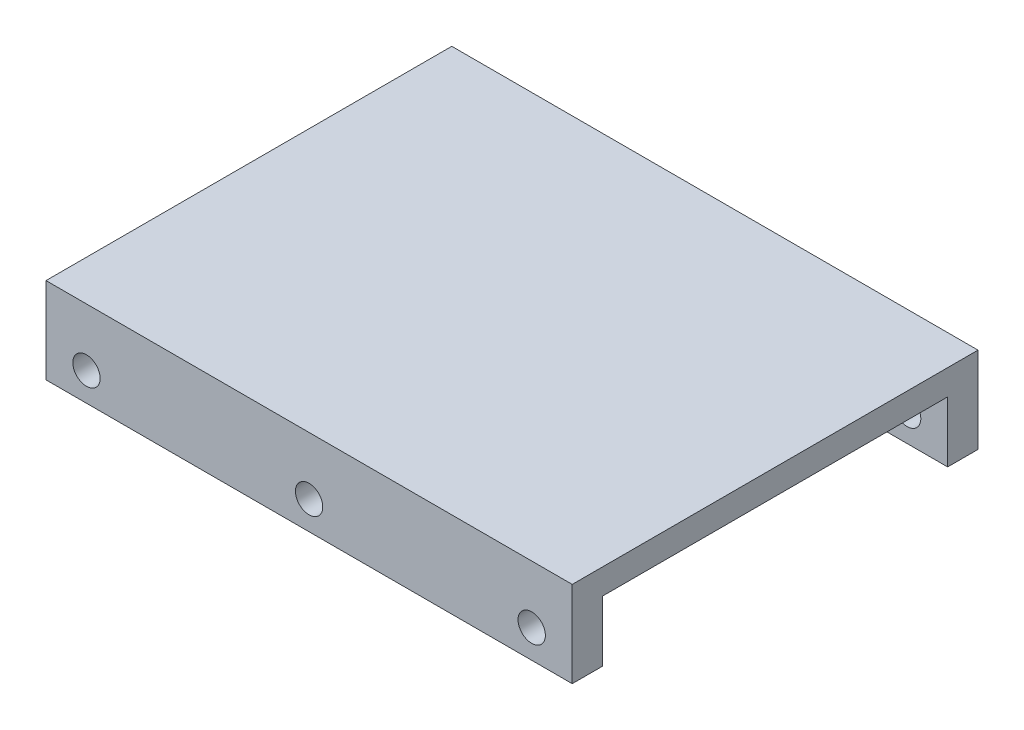
ISO-10303-21;
HEADER;
FILE_DESCRIPTION(('STEP AP214'),'2;1');
FILE_NAME('part.step','',(''),(''),'','','');
FILE_SCHEMA(('AUTOMOTIVE_DESIGN { 1 0 10303 214 1 1 1 1 }'));
ENDSEC;
DATA;
#1=APPLICATION_CONTEXT('core data for automotive mechanical design processes');
#2=APPLICATION_PROTOCOL_DEFINITION('international standard','automotive_design',2000,#1);
#3=PRODUCT_CONTEXT('',#1,'mechanical');
#4=PRODUCT('Part','Part','',(#3));
#5=PRODUCT_RELATED_PRODUCT_CATEGORY('part','',(#4));
#6=PRODUCT_DEFINITION_FORMATION('','',#4);
#7=PRODUCT_DEFINITION_CONTEXT('part definition',#1,'design');
#8=PRODUCT_DEFINITION('design','',#6,#7);
#9=PRODUCT_DEFINITION_SHAPE('','',#8);
#10=(LENGTH_UNIT() NAMED_UNIT(*) SI_UNIT(.MILLI.,.METRE.));
#11=(NAMED_UNIT(*) PLANE_ANGLE_UNIT() SI_UNIT($,.RADIAN.));
#12=(NAMED_UNIT(*) SI_UNIT($,.STERADIAN.) SOLID_ANGLE_UNIT());
#13=UNCERTAINTY_MEASURE_WITH_UNIT(LENGTH_MEASURE(1.E-05),#10,'distance_accuracy_value','');
#14=(GEOMETRIC_REPRESENTATION_CONTEXT(3) GLOBAL_UNCERTAINTY_ASSIGNED_CONTEXT((#13)) GLOBAL_UNIT_ASSIGNED_CONTEXT((#10,
#11,#12)) REPRESENTATION_CONTEXT('',''));
#15=CARTESIAN_POINT('',(0.,0.,0.));
#16=DIRECTION('',(0.,0.,1.));
#17=DIRECTION('',(1.,0.,0.));
#18=AXIS2_PLACEMENT_3D('',#15,#16,#17);
#19=CARTESIAN_POINT('',(76.,0.,40.1));
#20=DIRECTION('',(0.,1.,0.));
#21=DIRECTION('',(-1.,0.,0.));
#22=AXIS2_PLACEMENT_3D('',#19,#20,#21);
#23=PLANE('',#22);
#24=DIRECTION('',(1.,0.,0.));
#25=VECTOR('',#24,1.);
#26=CARTESIAN_POINT('',(76.,0.,40.1));
#27=LINE('',#26,#25);
#28=CARTESIAN_POINT('',(23.996,0.,40.1));
#29=VERTEX_POINT('',#28);
#30=CARTESIAN_POINT('',(76.,0.,40.1));
#31=VERTEX_POINT('',#30);
#32=EDGE_CURVE('E132',#29,#31,#27,.T.);
#33=ORIENTED_EDGE('',*,*,#32,.F.);
#34=DIRECTION('',(0.,0.,1.));
#35=VECTOR('',#34,1.);
#36=CARTESIAN_POINT('',(23.996,0.,0.));
#37=LINE('',#36,#35);
#38=CARTESIAN_POINT('',(23.996,0.,37.1));
#39=VERTEX_POINT('',#38);
#40=EDGE_CURVE('E105',#39,#29,#37,.T.);
#41=ORIENTED_EDGE('',*,*,#40,.F.);
#42=DIRECTION('',(-1.,0.,0.));
#43=VECTOR('',#42,1.);
#44=CARTESIAN_POINT('',(19.,0.,37.1));
#45=LINE('',#44,#43);
#46=CARTESIAN_POINT('',(76.,0.,37.1));
#47=VERTEX_POINT('',#46);
#48=EDGE_CURVE('E198',#47,#39,#45,.T.);
#49=ORIENTED_EDGE('',*,*,#48,.F.);
#50=DIRECTION('',(0.,0.,-1.));
#51=VECTOR('',#50,1.);
#52=CARTESIAN_POINT('',(76.,0.,40.1));
#53=LINE('',#52,#51);
#54=EDGE_CURVE('E137',#31,#47,#53,.T.);
#55=ORIENTED_EDGE('',*,*,#54,.F.);
#56=EDGE_LOOP('',(#33,#41,#49,#55));
#57=FACE_BOUND('',#56,.T.);
#58=ADVANCED_FACE('F34',(#57),#23,.F.);
#59=CARTESIAN_POINT('',(27.996,2.8,-10.7));
#60=DIRECTION('',(0.,0.,1.));
#61=DIRECTION('',(1.,0.,0.));
#62=AXIS2_PLACEMENT_3D('',#59,#60,#61);
#63=CYLINDRICAL_SURFACE('',#62,1.35);
#64=CARTESIAN_POINT('',(27.996,2.8,37.1));
#65=DIRECTION('',(0.,0.,1.));
#66=DIRECTION('',(1.,0.,0.));
#67=AXIS2_PLACEMENT_3D('',#64,#65,#66);
#68=CIRCLE('',#67,1.35);
#69=CARTESIAN_POINT('',(29.346,2.8,37.1));
#70=VERTEX_POINT('',#69);
#71=EDGE_CURVE('E175',#70,#70,#68,.F.);
#72=ORIENTED_EDGE('',*,*,#71,.T.);
#73=EDGE_LOOP('',(#72));
#74=FACE_BOUND('',#73,.T.);
#75=CARTESIAN_POINT('',(27.996,2.8,40.1));
#76=DIRECTION('',(0.,0.,1.));
#77=DIRECTION('',(1.,0.,0.));
#78=AXIS2_PLACEMENT_3D('',#75,#76,#77);
#79=CIRCLE('',#78,1.35);
#80=CARTESIAN_POINT('',(29.346,2.8,40.1));
#81=VERTEX_POINT('',#80);
#82=EDGE_CURVE('E125',#81,#81,#79,.T.);
#83=ORIENTED_EDGE('',*,*,#82,.T.);
#84=EDGE_LOOP('',(#83));
#85=FACE_BOUND('',#84,.T.);
#86=ADVANCED_FACE('F231',(#74,#85),#63,.F.);
#87=CARTESIAN_POINT('',(49.996,2.8,-10.7));
#88=DIRECTION('',(0.,0.,1.));
#89=DIRECTION('',(1.,0.,0.));
#90=AXIS2_PLACEMENT_3D('',#87,#88,#89);
#91=CYLINDRICAL_SURFACE('',#90,1.35);
#92=CARTESIAN_POINT('',(49.996,2.8,37.1));
#93=DIRECTION('',(0.,0.,1.));
#94=DIRECTION('',(1.,0.,0.));
#95=AXIS2_PLACEMENT_3D('',#92,#93,#94);
#96=CIRCLE('',#95,1.35);
#97=CARTESIAN_POINT('',(51.346,2.8,37.1));
#98=VERTEX_POINT('',#97);
#99=EDGE_CURVE('E155',#98,#98,#96,.F.);
#100=ORIENTED_EDGE('',*,*,#99,.T.);
#101=EDGE_LOOP('',(#100));
#102=FACE_BOUND('',#101,.T.);
#103=CARTESIAN_POINT('',(49.996,2.8,40.1));
#104=DIRECTION('',(0.,0.,1.));
#105=DIRECTION('',(1.,0.,0.));
#106=AXIS2_PLACEMENT_3D('',#103,#104,#105);
#107=CIRCLE('',#106,1.35);
#108=CARTESIAN_POINT('',(51.346,2.8,40.1));
#109=VERTEX_POINT('',#108);
#110=EDGE_CURVE('E143',#109,#109,#107,.T.);
#111=ORIENTED_EDGE('',*,*,#110,.T.);
#112=EDGE_LOOP('',(#111));
#113=FACE_BOUND('',#112,.T.);
#114=ADVANCED_FACE('F213',(#102,#113),#91,.F.);
#115=CARTESIAN_POINT('',(71.996,2.8,-10.7));
#116=DIRECTION('',(0.,0.,1.));
#117=DIRECTION('',(1.,0.,0.));
#118=AXIS2_PLACEMENT_3D('',#115,#116,#117);
#119=CYLINDRICAL_SURFACE('',#118,1.35000000000001);
#120=CARTESIAN_POINT('',(71.996,2.8,37.1));
#121=DIRECTION('',(0.,0.,1.));
#122=DIRECTION('',(1.,0.,0.));
#123=AXIS2_PLACEMENT_3D('',#120,#121,#122);
#124=CIRCLE('',#123,1.35000000000001);
#125=CARTESIAN_POINT('',(73.346,2.8,37.1));
#126=VERTEX_POINT('',#125);
#127=EDGE_CURVE('E153',#126,#126,#124,.F.);
#128=ORIENTED_EDGE('',*,*,#127,.T.);
#129=EDGE_LOOP('',(#128));
#130=FACE_BOUND('',#129,.T.);
#131=CARTESIAN_POINT('',(71.996,2.8,40.1));
#132=DIRECTION('',(0.,0.,1.));
#133=DIRECTION('',(1.,0.,0.));
#134=AXIS2_PLACEMENT_3D('',#131,#132,#133);
#135=CIRCLE('',#134,1.35000000000001);
#136=CARTESIAN_POINT('',(73.346,2.8,40.1));
#137=VERTEX_POINT('',#136);
#138=EDGE_CURVE('E147',#137,#137,#135,.T.);
#139=ORIENTED_EDGE('',*,*,#138,.T.);
#140=EDGE_LOOP('',(#139));
#141=FACE_BOUND('',#140,.T.);
#142=ADVANCED_FACE('F240',(#130,#141),#119,.F.);
#143=DIRECTION('',(1.,0.,0.));
#144=VECTOR('',#143,1.);
#145=CARTESIAN_POINT('',(19.,0.,3.));
#146=LINE('',#145,#144);
#147=CARTESIAN_POINT('',(23.996,0.,3.));
#148=VERTEX_POINT('',#147);
#149=CARTESIAN_POINT('',(76.,0.,3.));
#150=VERTEX_POINT('',#149);
#151=EDGE_CURVE('E113',#148,#150,#146,.T.);
#152=ORIENTED_EDGE('',*,*,#151,.F.);
#153=CARTESIAN_POINT('',(23.996,0.,0.));
#154=VERTEX_POINT('',#153);
#155=EDGE_CURVE('E49',#154,#148,#37,.T.);
#156=ORIENTED_EDGE('',*,*,#155,.F.);
#157=DIRECTION('',(1.,0.,0.));
#158=VECTOR('',#157,1.);
#159=CARTESIAN_POINT('',(76.,0.,0.));
#160=LINE('',#159,#158);
#161=CARTESIAN_POINT('',(76.,0.,0.));
#162=VERTEX_POINT('',#161);
#163=EDGE_CURVE('E111',#154,#162,#160,.T.);
#164=ORIENTED_EDGE('',*,*,#163,.T.);
#165=EDGE_CURVE('E136',#150,#162,#53,.T.);
#166=ORIENTED_EDGE('',*,*,#165,.F.);
#167=EDGE_LOOP('',(#152,#156,#164,#166));
#168=FACE_BOUND('',#167,.T.);
#169=ADVANCED_FACE('F36',(#168),#23,.F.);
#170=CARTESIAN_POINT('',(76.,8.5,40.1));
#171=DIRECTION('',(-1.,0.,0.));
#172=DIRECTION('',(0.,0.,1.));
#173=AXIS2_PLACEMENT_3D('',#170,#171,#172);
#174=PLANE('',#173);
#175=ORIENTED_EDGE('',*,*,#54,.T.);
#176=DIRECTION('',(0.,1.,0.));
#177=VECTOR('',#176,1.);
#178=CARTESIAN_POINT('',(76.,8.5,37.1));
#179=LINE('',#178,#177);
#180=CARTESIAN_POINT('',(76.,6.,37.1));
#181=VERTEX_POINT('',#180);
#182=EDGE_CURVE('E168',#47,#181,#179,.T.);
#183=ORIENTED_EDGE('',*,*,#182,.T.);
#184=DIRECTION('',(0.,0.,1.));
#185=VECTOR('',#184,1.);
#186=CARTESIAN_POINT('',(76.,6.,40.1));
#187=LINE('',#186,#185);
#188=CARTESIAN_POINT('',(76.,6.,3.));
#189=VERTEX_POINT('',#188);
#190=EDGE_CURVE('E42',#189,#181,#187,.T.);
#191=ORIENTED_EDGE('',*,*,#190,.F.);
#192=DIRECTION('',(0.,-1.,0.));
#193=VECTOR('',#192,1.);
#194=CARTESIAN_POINT('',(76.,8.5,3.));
#195=LINE('',#194,#193);
#196=EDGE_CURVE('E156',#189,#150,#195,.T.);
#197=ORIENTED_EDGE('',*,*,#196,.T.);
#198=ORIENTED_EDGE('',*,*,#165,.T.);
#199=DIRECTION('',(0.,1.,0.));
#200=VECTOR('',#199,1.);
#201=CARTESIAN_POINT('',(76.,8.5,0.));
#202=LINE('',#201,#200);
#203=CARTESIAN_POINT('',(76.,8.5,0.));
#204=VERTEX_POINT('',#203);
#205=EDGE_CURVE('E119',#162,#204,#202,.T.);
#206=ORIENTED_EDGE('',*,*,#205,.T.);
#207=DIRECTION('',(0.,0.,-1.));
#208=VECTOR('',#207,1.);
#209=CARTESIAN_POINT('',(76.,8.5,40.1));
#210=LINE('',#209,#208);
#211=CARTESIAN_POINT('',(76.,8.5,40.1));
#212=VERTEX_POINT('',#211);
#213=EDGE_CURVE('E133',#212,#204,#210,.T.);
#214=ORIENTED_EDGE('',*,*,#213,.F.);
#215=DIRECTION('',(0.,1.,0.));
#216=VECTOR('',#215,1.);
#217=CARTESIAN_POINT('',(76.,8.5,40.1));
#218=LINE('',#217,#216);
#219=EDGE_CURVE('E187',#31,#212,#218,.T.);
#220=ORIENTED_EDGE('',*,*,#219,.F.);
#221=EDGE_LOOP('',(#175,#183,#191,#197,#198,#206,#214,#220));
#222=FACE_BOUND('',#221,.T.);
#223=ADVANCED_FACE('F172',(#222),#174,.F.);
#224=CARTESIAN_POINT('',(6.00000000000001,8.5,40.1));
#225=DIRECTION('',(0.,-1.,0.));
#226=DIRECTION('',(0.,0.,-1.));
#227=AXIS2_PLACEMENT_3D('',#224,#225,#226);
#228=PLANE('',#227);
#229=DIRECTION('',(-1.,0.,0.));
#230=VECTOR('',#229,1.);
#231=CARTESIAN_POINT('',(6.00000000000001,8.5,0.));
#232=LINE('',#231,#230);
#233=CARTESIAN_POINT('',(23.996,8.5,0.));
#234=VERTEX_POINT('',#233);
#235=EDGE_CURVE('E122',#204,#234,#232,.T.);
#236=ORIENTED_EDGE('',*,*,#235,.T.);
#237=DIRECTION('',(0.,0.,1.));
#238=VECTOR('',#237,1.);
#239=CARTESIAN_POINT('',(23.996,8.5,40.1));
#240=LINE('',#239,#238);
#241=CARTESIAN_POINT('',(23.996,8.5,40.1));
#242=VERTEX_POINT('',#241);
#243=EDGE_CURVE('E100',#234,#242,#240,.T.);
#244=ORIENTED_EDGE('',*,*,#243,.T.);
#245=DIRECTION('',(-1.,0.,0.));
#246=VECTOR('',#245,1.);
#247=CARTESIAN_POINT('',(6.00000000000001,8.5,40.1));
#248=LINE('',#247,#246);
#249=EDGE_CURVE('E128',#212,#242,#248,.T.);
#250=ORIENTED_EDGE('',*,*,#249,.F.);
#251=ORIENTED_EDGE('',*,*,#213,.T.);
#252=EDGE_LOOP('',(#236,#244,#250,#251));
#253=FACE_BOUND('',#252,.T.);
#254=ADVANCED_FACE('F196',(#253),#228,.F.);
#255=CARTESIAN_POINT('',(0.,0.,40.1));
#256=DIRECTION('',(0.,0.,-1.));
#257=DIRECTION('',(-1.,0.,0.));
#258=AXIS2_PLACEMENT_3D('',#255,#256,#257);
#259=PLANE('',#258);
#260=ORIENTED_EDGE('',*,*,#138,.F.);
#261=EDGE_LOOP('',(#260));
#262=FACE_BOUND('',#261,.T.);
#263=ORIENTED_EDGE('',*,*,#110,.F.);
#264=EDGE_LOOP('',(#263));
#265=FACE_BOUND('',#264,.T.);
#266=ORIENTED_EDGE('',*,*,#82,.F.);
#267=EDGE_LOOP('',(#266));
#268=FACE_BOUND('',#267,.T.);
#269=ORIENTED_EDGE('',*,*,#249,.T.);
#270=DIRECTION('',(0.,1.,0.));
#271=VECTOR('',#270,1.);
#272=CARTESIAN_POINT('',(23.996,0.,40.1));
#273=LINE('',#272,#271);
#274=EDGE_CURVE('E106',#29,#242,#273,.T.);
#275=ORIENTED_EDGE('',*,*,#274,.F.);
#276=ORIENTED_EDGE('',*,*,#32,.T.);
#277=ORIENTED_EDGE('',*,*,#219,.T.);
#278=EDGE_LOOP('',(#269,#275,#276,#277));
#279=FACE_BOUND('',#278,.T.);
#280=ADVANCED_FACE('F193',(#262,#265,#268,#279),#259,.F.);
#281=CARTESIAN_POINT('',(0.,0.,0.));
#282=DIRECTION('',(0.,0.,-1.));
#283=DIRECTION('',(-1.,0.,0.));
#284=AXIS2_PLACEMENT_3D('',#281,#282,#283);
#285=PLANE('',#284);
#286=DIRECTION('',(0.,1.,0.));
#287=VECTOR('',#286,1.);
#288=CARTESIAN_POINT('',(23.996,0.,0.));
#289=LINE('',#288,#287);
#290=EDGE_CURVE('E97',#154,#234,#289,.T.);
#291=ORIENTED_EDGE('',*,*,#290,.T.);
#292=ORIENTED_EDGE('',*,*,#235,.F.);
#293=ORIENTED_EDGE('',*,*,#205,.F.);
#294=ORIENTED_EDGE('',*,*,#163,.F.);
#295=EDGE_LOOP('',(#291,#292,#293,#294));
#296=FACE_BOUND('',#295,.T.);
#297=CARTESIAN_POINT('',(71.996,2.8,0.));
#298=DIRECTION('',(0.,0.,-1.));
#299=DIRECTION('',(-1.,0.,0.));
#300=AXIS2_PLACEMENT_3D('',#297,#298,#299);
#301=CIRCLE('',#300,1.35000000000001);
#302=CARTESIAN_POINT('',(70.646,2.8,0.));
#303=VERTEX_POINT('',#302);
#304=EDGE_CURVE('E144',#303,#303,#301,.T.);
#305=ORIENTED_EDGE('',*,*,#304,.F.);
#306=EDGE_LOOP('',(#305));
#307=FACE_BOUND('',#306,.T.);
#308=CARTESIAN_POINT('',(49.996,2.8,0.));
#309=DIRECTION('',(0.,0.,-1.));
#310=DIRECTION('',(-1.,0.,0.));
#311=AXIS2_PLACEMENT_3D('',#308,#309,#310);
#312=CIRCLE('',#311,1.35);
#313=CARTESIAN_POINT('',(48.646,2.8,0.));
#314=VERTEX_POINT('',#313);
#315=EDGE_CURVE('E140',#314,#314,#312,.T.);
#316=ORIENTED_EDGE('',*,*,#315,.F.);
#317=EDGE_LOOP('',(#316));
#318=FACE_BOUND('',#317,.T.);
#319=CARTESIAN_POINT('',(27.996,2.8,0.));
#320=DIRECTION('',(0.,0.,-1.));
#321=DIRECTION('',(-1.,0.,0.));
#322=AXIS2_PLACEMENT_3D('',#319,#320,#321);
#323=CIRCLE('',#322,1.35);
#324=CARTESIAN_POINT('',(26.646,2.8,0.));
#325=VERTEX_POINT('',#324);
#326=EDGE_CURVE('E120',#325,#325,#323,.T.);
#327=ORIENTED_EDGE('',*,*,#326,.F.);
#328=EDGE_LOOP('',(#327));
#329=FACE_BOUND('',#328,.T.);
#330=ADVANCED_FACE('F117',(#296,#307,#318,#329),#285,.T.);
#331=CARTESIAN_POINT('',(27.996,2.8,3.));
#332=DIRECTION('',(0.,0.,-1.));
#333=DIRECTION('',(-1.,0.,0.));
#334=AXIS2_PLACEMENT_3D('',#331,#332,#333);
#335=CIRCLE('',#334,1.35);
#336=CARTESIAN_POINT('',(26.646,2.8,3.));
#337=VERTEX_POINT('',#336);
#338=EDGE_CURVE('E207',#337,#337,#335,.F.);
#339=ORIENTED_EDGE('',*,*,#338,.T.);
#340=EDGE_LOOP('',(#339));
#341=FACE_BOUND('',#340,.T.);
#342=ORIENTED_EDGE('',*,*,#326,.T.);
#343=EDGE_LOOP('',(#342));
#344=FACE_BOUND('',#343,.T.);
#345=ADVANCED_FACE('F238',(#341,#344),#63,.F.);
#346=CARTESIAN_POINT('',(49.996,2.8,3.));
#347=DIRECTION('',(0.,0.,-1.));
#348=DIRECTION('',(-1.,0.,0.));
#349=AXIS2_PLACEMENT_3D('',#346,#347,#348);
#350=CIRCLE('',#349,1.35);
#351=CARTESIAN_POINT('',(48.646,2.8,3.));
#352=VERTEX_POINT('',#351);
#353=EDGE_CURVE('E151',#352,#352,#350,.F.);
#354=ORIENTED_EDGE('',*,*,#353,.T.);
#355=EDGE_LOOP('',(#354));
#356=FACE_BOUND('',#355,.T.);
#357=ORIENTED_EDGE('',*,*,#315,.T.);
#358=EDGE_LOOP('',(#357));
#359=FACE_BOUND('',#358,.T.);
#360=ADVANCED_FACE('F251',(#356,#359),#91,.F.);
#361=CARTESIAN_POINT('',(71.996,2.8,3.));
#362=DIRECTION('',(0.,0.,-1.));
#363=DIRECTION('',(-1.,0.,0.));
#364=AXIS2_PLACEMENT_3D('',#361,#362,#363);
#365=CIRCLE('',#364,1.35000000000001);
#366=CARTESIAN_POINT('',(70.646,2.8,3.));
#367=VERTEX_POINT('',#366);
#368=EDGE_CURVE('E148',#367,#367,#365,.F.);
#369=ORIENTED_EDGE('',*,*,#368,.T.);
#370=EDGE_LOOP('',(#369));
#371=FACE_BOUND('',#370,.T.);
#372=ORIENTED_EDGE('',*,*,#304,.T.);
#373=EDGE_LOOP('',(#372));
#374=FACE_BOUND('',#373,.T.);
#375=ADVANCED_FACE('F226',(#371,#374),#119,.F.);
#376=CARTESIAN_POINT('',(0.,6.,0.));
#377=DIRECTION('',(0.,-1.,0.));
#378=DIRECTION('',(1.,0.,0.));
#379=AXIS2_PLACEMENT_3D('',#376,#377,#378);
#380=PLANE('',#379);
#381=DIRECTION('',(0.,0.,1.));
#382=VECTOR('',#381,1.);
#383=CARTESIAN_POINT('',(23.996,6.,0.));
#384=LINE('',#383,#382);
#385=CARTESIAN_POINT('',(23.996,6.,3.));
#386=VERTEX_POINT('',#385);
#387=CARTESIAN_POINT('',(23.996,6.,37.1));
#388=VERTEX_POINT('',#387);
#389=EDGE_CURVE('E114',#386,#388,#384,.T.);
#390=ORIENTED_EDGE('',*,*,#389,.F.);
#391=DIRECTION('',(1.,0.,0.));
#392=VECTOR('',#391,1.);
#393=CARTESIAN_POINT('',(19.,6.,3.));
#394=LINE('',#393,#392);
#395=EDGE_CURVE('E56',#386,#189,#394,.T.);
#396=ORIENTED_EDGE('',*,*,#395,.T.);
#397=ORIENTED_EDGE('',*,*,#190,.T.);
#398=DIRECTION('',(-1.,0.,0.));
#399=VECTOR('',#398,1.);
#400=CARTESIAN_POINT('',(19.,6.,37.1));
#401=LINE('',#400,#399);
#402=EDGE_CURVE('E152',#181,#388,#401,.T.);
#403=ORIENTED_EDGE('',*,*,#402,.T.);
#404=EDGE_LOOP('',(#390,#396,#397,#403));
#405=FACE_BOUND('',#404,.T.);
#406=ADVANCED_FACE('F160',(#405),#380,.T.);
#407=CARTESIAN_POINT('',(19.,6.,37.1));
#408=DIRECTION('',(0.,0.,1.));
#409=DIRECTION('',(1.,0.,0.));
#410=AXIS2_PLACEMENT_3D('',#407,#408,#409);
#411=PLANE('',#410);
#412=ORIENTED_EDGE('',*,*,#71,.F.);
#413=EDGE_LOOP('',(#412));
#414=FACE_BOUND('',#413,.T.);
#415=ORIENTED_EDGE('',*,*,#127,.F.);
#416=EDGE_LOOP('',(#415));
#417=FACE_BOUND('',#416,.T.);
#418=ORIENTED_EDGE('',*,*,#99,.F.);
#419=EDGE_LOOP('',(#418));
#420=FACE_BOUND('',#419,.T.);
#421=ORIENTED_EDGE('',*,*,#48,.T.);
#422=DIRECTION('',(0.,1.,0.));
#423=VECTOR('',#422,1.);
#424=CARTESIAN_POINT('',(23.996,6.,37.1));
#425=LINE('',#424,#423);
#426=EDGE_CURVE('E170',#39,#388,#425,.T.);
#427=ORIENTED_EDGE('',*,*,#426,.T.);
#428=ORIENTED_EDGE('',*,*,#402,.F.);
#429=ORIENTED_EDGE('',*,*,#182,.F.);
#430=EDGE_LOOP('',(#421,#427,#428,#429));
#431=FACE_BOUND('',#430,.T.);
#432=ADVANCED_FACE('F167',(#414,#417,#420,#431),#411,.F.);
#433=CARTESIAN_POINT('',(19.,6.,3.));
#434=DIRECTION('',(0.,0.,-1.));
#435=DIRECTION('',(-1.,0.,0.));
#436=AXIS2_PLACEMENT_3D('',#433,#434,#435);
#437=PLANE('',#436);
#438=ORIENTED_EDGE('',*,*,#338,.F.);
#439=EDGE_LOOP('',(#438));
#440=FACE_BOUND('',#439,.T.);
#441=ORIENTED_EDGE('',*,*,#368,.F.);
#442=EDGE_LOOP('',(#441));
#443=FACE_BOUND('',#442,.T.);
#444=ORIENTED_EDGE('',*,*,#353,.F.);
#445=EDGE_LOOP('',(#444));
#446=FACE_BOUND('',#445,.T.);
#447=ORIENTED_EDGE('',*,*,#395,.F.);
#448=DIRECTION('',(0.,-1.,0.));
#449=VECTOR('',#448,1.);
#450=CARTESIAN_POINT('',(23.996,6.,3.));
#451=LINE('',#450,#449);
#452=EDGE_CURVE('E11',#386,#148,#451,.T.);
#453=ORIENTED_EDGE('',*,*,#452,.T.);
#454=ORIENTED_EDGE('',*,*,#151,.T.);
#455=ORIENTED_EDGE('',*,*,#196,.F.);
#456=EDGE_LOOP('',(#447,#453,#454,#455));
#457=FACE_BOUND('',#456,.T.);
#458=ADVANCED_FACE('F217',(#440,#443,#446,#457),#437,.F.);
#459=CARTESIAN_POINT('',(23.996,0.,0.));
#460=DIRECTION('',(1.,0.,0.));
#461=DIRECTION('',(0.,0.,-1.));
#462=AXIS2_PLACEMENT_3D('',#459,#460,#461);
#463=PLANE('',#462);
#464=ORIENTED_EDGE('',*,*,#290,.F.);
#465=ORIENTED_EDGE('',*,*,#155,.T.);
#466=ORIENTED_EDGE('',*,*,#452,.F.);
#467=ORIENTED_EDGE('',*,*,#389,.T.);
#468=ORIENTED_EDGE('',*,*,#426,.F.);
#469=ORIENTED_EDGE('',*,*,#40,.T.);
#470=ORIENTED_EDGE('',*,*,#274,.T.);
#471=ORIENTED_EDGE('',*,*,#243,.F.);
#472=EDGE_LOOP('',(#464,#465,#466,#467,#468,#469,#470,#471));
#473=FACE_BOUND('',#472,.T.);
#474=ADVANCED_FACE('F98',(#473),#463,.F.);
#475=CLOSED_SHELL('',(#58,#86,#114,#142,#169,#223,#254,#280,#330,#345,#360,#375,#406,#432,#458,#474));
#476=MANIFOLD_SOLID_BREP('B2',#475);
#477=ADVANCED_BREP_SHAPE_REPRESENTATION('',(#18,#476),#14);
#478=SHAPE_DEFINITION_REPRESENTATION(#9,#477);
ENDSEC;
END-ISO-10303-21;
